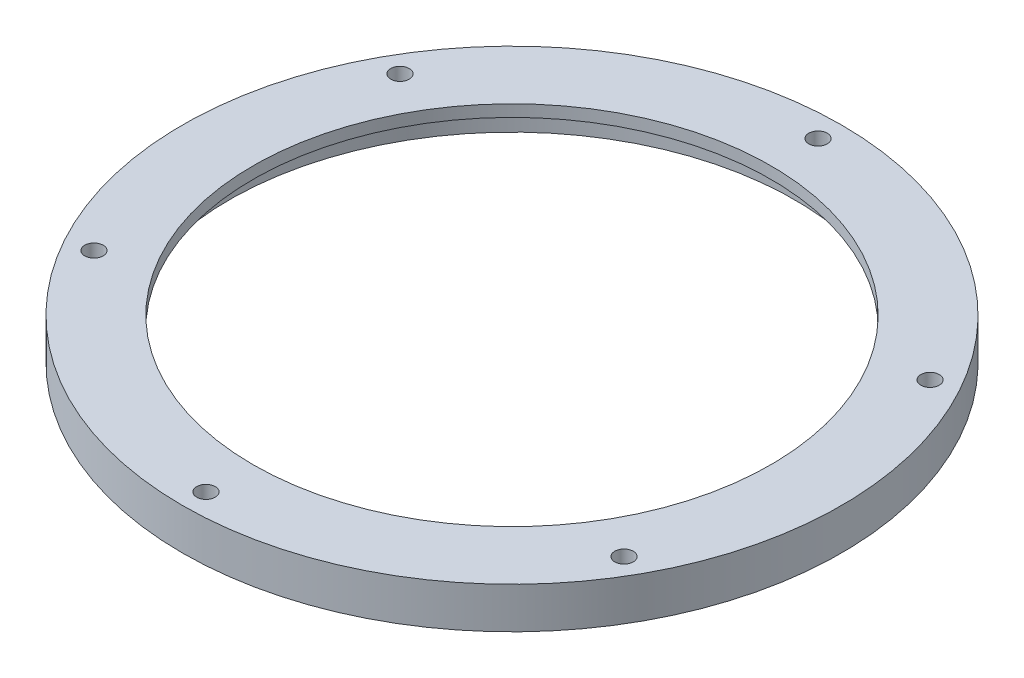
ISO-10303-21;
HEADER;
FILE_DESCRIPTION(('STEP AP214'),'2;1');
FILE_NAME('part.step','',(''),(''),'','','');
FILE_SCHEMA(('AUTOMOTIVE_DESIGN { 1 0 10303 214 1 1 1 1 }'));
ENDSEC;
DATA;
#1=APPLICATION_CONTEXT('core data for automotive mechanical design processes');
#2=APPLICATION_PROTOCOL_DEFINITION('international standard','automotive_design',2000,#1);
#3=PRODUCT_CONTEXT('',#1,'mechanical');
#4=PRODUCT('Part','Part','',(#3));
#5=PRODUCT_RELATED_PRODUCT_CATEGORY('part','',(#4));
#6=PRODUCT_DEFINITION_FORMATION('','',#4);
#7=PRODUCT_DEFINITION_CONTEXT('part definition',#1,'design');
#8=PRODUCT_DEFINITION('design','',#6,#7);
#9=PRODUCT_DEFINITION_SHAPE('','',#8);
#10=(LENGTH_UNIT() NAMED_UNIT(*) SI_UNIT(.MILLI.,.METRE.));
#11=(NAMED_UNIT(*) PLANE_ANGLE_UNIT() SI_UNIT($,.RADIAN.));
#12=(NAMED_UNIT(*) SI_UNIT($,.STERADIAN.) SOLID_ANGLE_UNIT());
#13=UNCERTAINTY_MEASURE_WITH_UNIT(LENGTH_MEASURE(1.E-05),#10,'distance_accuracy_value','');
#14=(GEOMETRIC_REPRESENTATION_CONTEXT(3) GLOBAL_UNCERTAINTY_ASSIGNED_CONTEXT((#13)) GLOBAL_UNIT_ASSIGNED_CONTEXT((#10,
#11,#12)) REPRESENTATION_CONTEXT('',''));
#15=CARTESIAN_POINT('',(0.,0.,0.));
#16=DIRECTION('',(0.,0.,1.));
#17=DIRECTION('',(1.,0.,0.));
#18=AXIS2_PLACEMENT_3D('',#15,#16,#17);
#19=CARTESIAN_POINT('',(0.,0.,0.));
#20=DIRECTION('',(0.,1.,0.));
#21=DIRECTION('',(0.,0.,1.));
#22=AXIS2_PLACEMENT_3D('',#19,#20,#21);
#23=PLANE('',#22);
#24=CARTESIAN_POINT('',(71.4903970824049,0.,-41.2750000000008));
#25=DIRECTION('',(0.,1.,0.));
#26=DIRECTION('',(-0.866025403784433,0.,0.50000000000001));
#27=AXIS2_PLACEMENT_3D('',#24,#25,#26);
#28=CIRCLE('',#27,2.5);
#29=CARTESIAN_POINT('',(69.3253335729438,0.,-40.0250000000008));
#30=VERTEX_POINT('',#29);
#31=EDGE_CURVE('E85',#30,#30,#28,.T.);
#32=ORIENTED_EDGE('',*,*,#31,.T.);
#33=EDGE_LOOP('',(#32));
#34=FACE_BOUND('',#33,.T.);
#35=CARTESIAN_POINT('',(71.4903970824058,0.,41.2749999999993));
#36=DIRECTION('',(0.,1.,0.));
#37=DIRECTION('',(-0.866025403784443,0.,-0.499999999999992));
#38=AXIS2_PLACEMENT_3D('',#35,#36,#37);
#39=CIRCLE('',#38,2.5);
#40=CARTESIAN_POINT('',(69.3253335729447,0.,40.0249999999994));
#41=VERTEX_POINT('',#40);
#42=EDGE_CURVE('E91',#41,#41,#39,.T.);
#43=ORIENTED_EDGE('',*,*,#42,.T.);
#44=EDGE_LOOP('',(#43));
#45=FACE_BOUND('',#44,.T.);
#46=CARTESIAN_POINT('',(0.,0.,82.55));
#47=DIRECTION('',(0.,1.,0.));
#48=DIRECTION('',(0.,0.,-1.));
#49=AXIS2_PLACEMENT_3D('',#46,#47,#48);
#50=CIRCLE('',#49,2.5);
#51=CARTESIAN_POINT('',(0.,0.,80.05));
#52=VERTEX_POINT('',#51);
#53=EDGE_CURVE('E97',#52,#52,#50,.T.);
#54=ORIENTED_EDGE('',*,*,#53,.T.);
#55=EDGE_LOOP('',(#54));
#56=FACE_BOUND('',#55,.T.);
#57=CARTESIAN_POINT('',(-71.4903970824052,0.,41.2750000000003));
#58=DIRECTION('',(0.,1.,0.));
#59=DIRECTION('',(0.866025403784436,0.,-0.500000000000004));
#60=AXIS2_PLACEMENT_3D('',#57,#58,#59);
#61=CIRCLE('',#60,2.5);
#62=CARTESIAN_POINT('',(-69.3253335729441,0.,40.0250000000003));
#63=VERTEX_POINT('',#62);
#64=EDGE_CURVE('E79',#63,#63,#61,.T.);
#65=ORIENTED_EDGE('',*,*,#64,.T.);
#66=EDGE_LOOP('',(#65));
#67=FACE_BOUND('',#66,.T.);
#68=CARTESIAN_POINT('',(-71.4903970824055,0.,-41.2749999999998));
#69=DIRECTION('',(0.,1.,0.));
#70=DIRECTION('',(0.86602540378444,0.,0.499999999999998));
#71=AXIS2_PLACEMENT_3D('',#68,#69,#70);
#72=CIRCLE('',#71,2.5);
#73=CARTESIAN_POINT('',(-69.3253335729444,0.,-40.0249999999998));
#74=VERTEX_POINT('',#73);
#75=EDGE_CURVE('E73',#74,#74,#72,.T.);
#76=ORIENTED_EDGE('',*,*,#75,.T.);
#77=EDGE_LOOP('',(#76));
#78=FACE_BOUND('',#77,.T.);
#79=CARTESIAN_POINT('',(0.,0.,-82.55));
#80=DIRECTION('',(0.,1.,0.));
#81=DIRECTION('',(0.,0.,1.));
#82=AXIS2_PLACEMENT_3D('',#79,#80,#81);
#83=CIRCLE('',#82,2.5);
#84=CARTESIAN_POINT('',(0.,0.,-80.05));
#85=VERTEX_POINT('',#84);
#86=EDGE_CURVE('E67',#85,#85,#83,.T.);
#87=ORIENTED_EDGE('',*,*,#86,.T.);
#88=EDGE_LOOP('',(#87));
#89=FACE_BOUND('',#88,.T.);
#90=CARTESIAN_POINT('',(0.,0.,0.));
#91=DIRECTION('',(0.,1.,0.));
#92=DIRECTION('',(0.,0.,1.));
#93=AXIS2_PLACEMENT_3D('',#90,#91,#92);
#94=CIRCLE('',#93,88.9);
#95=CARTESIAN_POINT('',(0.,0.,88.9));
#96=VERTEX_POINT('',#95);
#97=EDGE_CURVE('E10',#96,#96,#94,.T.);
#98=ORIENTED_EDGE('',*,*,#97,.F.);
#99=EDGE_LOOP('',(#98));
#100=FACE_BOUND('',#99,.T.);
#101=CARTESIAN_POINT('',(0.,0.,0.));
#102=DIRECTION('',(0.,1.,0.));
#103=DIRECTION('',(0.,0.,1.));
#104=AXIS2_PLACEMENT_3D('',#101,#102,#103);
#105=CIRCLE('',#104,76.2);
#106=CARTESIAN_POINT('',(0.,0.,76.2));
#107=VERTEX_POINT('',#106);
#108=EDGE_CURVE('E50',#107,#107,#105,.T.);
#109=ORIENTED_EDGE('',*,*,#108,.T.);
#110=EDGE_LOOP('',(#109));
#111=FACE_BOUND('',#110,.T.);
#112=ADVANCED_FACE('F43',(#34,#45,#56,#67,#78,#89,#100,#111),#23,.F.);
#113=CARTESIAN_POINT('',(0.,7.9375,0.));
#114=DIRECTION('',(0.,-1.,0.));
#115=DIRECTION('',(0.,0.,-1.));
#116=AXIS2_PLACEMENT_3D('',#113,#114,#115);
#117=CYLINDRICAL_SURFACE('',#116,88.9);
#118=ORIENTED_EDGE('',*,*,#97,.T.);
#119=EDGE_LOOP('',(#118));
#120=FACE_BOUND('',#119,.T.);
#121=CARTESIAN_POINT('',(0.,11.1125,0.));
#122=DIRECTION('',(0.,1.,0.));
#123=DIRECTION('',(0.,0.,1.));
#124=AXIS2_PLACEMENT_3D('',#121,#122,#123);
#125=CIRCLE('',#124,88.9);
#126=CARTESIAN_POINT('',(0.,11.1125,88.9));
#127=VERTEX_POINT('',#126);
#128=EDGE_CURVE('E58',#127,#127,#125,.T.);
#129=ORIENTED_EDGE('',*,*,#128,.F.);
#130=EDGE_LOOP('',(#129));
#131=FACE_BOUND('',#130,.T.);
#132=ADVANCED_FACE('F45',(#120,#131),#117,.T.);
#133=CARTESIAN_POINT('',(0.,7.9375,0.));
#134=DIRECTION('',(0.,-1.,0.));
#135=DIRECTION('',(0.,0.,-1.));
#136=AXIS2_PLACEMENT_3D('',#133,#134,#135);
#137=CYLINDRICAL_SURFACE('',#136,76.2);
#138=CARTESIAN_POINT('',(0.,7.9375,0.));
#139=DIRECTION('',(0.,1.,0.));
#140=DIRECTION('',(0.,0.,1.));
#141=AXIS2_PLACEMENT_3D('',#138,#139,#140);
#142=CIRCLE('',#141,76.2);
#143=CARTESIAN_POINT('',(0.,7.9375,76.2));
#144=VERTEX_POINT('',#143);
#145=EDGE_CURVE('E54',#144,#144,#142,.T.);
#146=ORIENTED_EDGE('',*,*,#145,.T.);
#147=EDGE_LOOP('',(#146));
#148=FACE_BOUND('',#147,.T.);
#149=ORIENTED_EDGE('',*,*,#108,.F.);
#150=EDGE_LOOP('',(#149));
#151=FACE_BOUND('',#150,.T.);
#152=ADVANCED_FACE('F139',(#148,#151),#137,.F.);
#153=CARTESIAN_POINT('',(0.,7.9375,0.));
#154=DIRECTION('',(0.,1.,0.));
#155=DIRECTION('',(0.,0.,1.));
#156=AXIS2_PLACEMENT_3D('',#153,#154,#155);
#157=PLANE('',#156);
#158=CARTESIAN_POINT('',(0.,7.9375,0.));
#159=DIRECTION('',(0.,1.,0.));
#160=DIRECTION('',(0.,0.,1.));
#161=AXIS2_PLACEMENT_3D('',#158,#159,#160);
#162=CIRCLE('',#161,69.85);
#163=CARTESIAN_POINT('',(0.,7.9375,69.85));
#164=VERTEX_POINT('',#163);
#165=EDGE_CURVE('E64',#164,#164,#162,.T.);
#166=ORIENTED_EDGE('',*,*,#165,.T.);
#167=EDGE_LOOP('',(#166));
#168=FACE_BOUND('',#167,.T.);
#169=ORIENTED_EDGE('',*,*,#145,.F.);
#170=EDGE_LOOP('',(#169));
#171=FACE_BOUND('',#170,.T.);
#172=ADVANCED_FACE('F120',(#168,#171),#157,.F.);
#173=CARTESIAN_POINT('',(0.,11.1125,0.));
#174=DIRECTION('',(0.,1.,0.));
#175=DIRECTION('',(0.,0.,1.));
#176=AXIS2_PLACEMENT_3D('',#173,#174,#175);
#177=PLANE('',#176);
#178=CARTESIAN_POINT('',(71.4903970824049,11.1125,-41.2750000000008));
#179=DIRECTION('',(0.,1.,0.));
#180=DIRECTION('',(-0.866025403784433,0.,0.50000000000001));
#181=AXIS2_PLACEMENT_3D('',#178,#179,#180);
#182=CIRCLE('',#181,2.5);
#183=CARTESIAN_POINT('',(69.3253335729438,11.1125,-40.0250000000008));
#184=VERTEX_POINT('',#183);
#185=EDGE_CURVE('E82',#184,#184,#182,.T.);
#186=ORIENTED_EDGE('',*,*,#185,.F.);
#187=EDGE_LOOP('',(#186));
#188=FACE_BOUND('',#187,.T.);
#189=CARTESIAN_POINT('',(71.4903970824058,11.1125,41.2749999999993));
#190=DIRECTION('',(0.,1.,0.));
#191=DIRECTION('',(-0.866025403784443,0.,-0.499999999999992));
#192=AXIS2_PLACEMENT_3D('',#189,#190,#191);
#193=CIRCLE('',#192,2.5);
#194=CARTESIAN_POINT('',(69.3253335729447,11.1125,40.0249999999994));
#195=VERTEX_POINT('',#194);
#196=EDGE_CURVE('E88',#195,#195,#193,.T.);
#197=ORIENTED_EDGE('',*,*,#196,.F.);
#198=EDGE_LOOP('',(#197));
#199=FACE_BOUND('',#198,.T.);
#200=CARTESIAN_POINT('',(0.,11.1125,82.55));
#201=DIRECTION('',(0.,1.,0.));
#202=DIRECTION('',(0.,0.,-1.));
#203=AXIS2_PLACEMENT_3D('',#200,#201,#202);
#204=CIRCLE('',#203,2.5);
#205=CARTESIAN_POINT('',(0.,11.1125,80.05));
#206=VERTEX_POINT('',#205);
#207=EDGE_CURVE('E94',#206,#206,#204,.T.);
#208=ORIENTED_EDGE('',*,*,#207,.F.);
#209=EDGE_LOOP('',(#208));
#210=FACE_BOUND('',#209,.T.);
#211=CARTESIAN_POINT('',(-71.4903970824052,11.1125,41.2750000000003));
#212=DIRECTION('',(0.,1.,0.));
#213=DIRECTION('',(0.866025403784436,0.,-0.500000000000004));
#214=AXIS2_PLACEMENT_3D('',#211,#212,#213);
#215=CIRCLE('',#214,2.5);
#216=CARTESIAN_POINT('',(-69.3253335729441,11.1125,40.0250000000003));
#217=VERTEX_POINT('',#216);
#218=EDGE_CURVE('E100',#217,#217,#215,.T.);
#219=ORIENTED_EDGE('',*,*,#218,.F.);
#220=EDGE_LOOP('',(#219));
#221=FACE_BOUND('',#220,.T.);
#222=CARTESIAN_POINT('',(-71.4903970824055,11.1125,-41.2749999999998));
#223=DIRECTION('',(0.,1.,0.));
#224=DIRECTION('',(0.86602540378444,0.,0.499999999999998));
#225=AXIS2_PLACEMENT_3D('',#222,#223,#224);
#226=CIRCLE('',#225,2.5);
#227=CARTESIAN_POINT('',(-69.3253335729444,11.1125,-40.0249999999998));
#228=VERTEX_POINT('',#227);
#229=EDGE_CURVE('E76',#228,#228,#226,.T.);
#230=ORIENTED_EDGE('',*,*,#229,.F.);
#231=EDGE_LOOP('',(#230));
#232=FACE_BOUND('',#231,.T.);
#233=CARTESIAN_POINT('',(0.,11.1125,-82.55));
#234=DIRECTION('',(0.,1.,0.));
#235=DIRECTION('',(0.,0.,1.));
#236=AXIS2_PLACEMENT_3D('',#233,#234,#235);
#237=CIRCLE('',#236,2.5);
#238=CARTESIAN_POINT('',(0.,11.1125,-80.05));
#239=VERTEX_POINT('',#238);
#240=EDGE_CURVE('E70',#239,#239,#237,.T.);
#241=ORIENTED_EDGE('',*,*,#240,.F.);
#242=EDGE_LOOP('',(#241));
#243=FACE_BOUND('',#242,.T.);
#244=ORIENTED_EDGE('',*,*,#128,.T.);
#245=EDGE_LOOP('',(#244));
#246=FACE_BOUND('',#245,.T.);
#247=CARTESIAN_POINT('',(0.,11.1125,0.));
#248=DIRECTION('',(0.,1.,0.));
#249=DIRECTION('',(0.,0.,1.));
#250=AXIS2_PLACEMENT_3D('',#247,#248,#249);
#251=CIRCLE('',#250,69.85);
#252=CARTESIAN_POINT('',(0.,11.1125,69.85));
#253=VERTEX_POINT('',#252);
#254=EDGE_CURVE('E63',#253,#253,#251,.T.);
#255=ORIENTED_EDGE('',*,*,#254,.F.);
#256=EDGE_LOOP('',(#255));
#257=FACE_BOUND('',#256,.T.);
#258=ADVANCED_FACE('F116',(#188,#199,#210,#221,#232,#243,#246,#257),#177,.T.);
#259=CARTESIAN_POINT('',(0.,11.1125,0.));
#260=DIRECTION('',(0.,-1.,0.));
#261=DIRECTION('',(0.,0.,-1.));
#262=AXIS2_PLACEMENT_3D('',#259,#260,#261);
#263=CYLINDRICAL_SURFACE('',#262,69.85);
#264=ORIENTED_EDGE('',*,*,#254,.T.);
#265=EDGE_LOOP('',(#264));
#266=FACE_BOUND('',#265,.T.);
#267=ORIENTED_EDGE('',*,*,#165,.F.);
#268=EDGE_LOOP('',(#267));
#269=FACE_BOUND('',#268,.T.);
#270=ADVANCED_FACE('F119',(#266,#269),#263,.F.);
#271=CARTESIAN_POINT('',(0.,0.,-82.55));
#272=DIRECTION('',(0.,1.,0.));
#273=DIRECTION('',(0.,0.,1.));
#274=AXIS2_PLACEMENT_3D('',#271,#272,#273);
#275=CYLINDRICAL_SURFACE('',#274,2.5);
#276=ORIENTED_EDGE('',*,*,#86,.F.);
#277=EDGE_LOOP('',(#276));
#278=FACE_BOUND('',#277,.T.);
#279=ORIENTED_EDGE('',*,*,#240,.T.);
#280=EDGE_LOOP('',(#279));
#281=FACE_BOUND('',#280,.T.);
#282=ADVANCED_FACE('F133',(#278,#281),#275,.F.);
#283=CARTESIAN_POINT('',(-71.4903970824055,0.,-41.2749999999998));
#284=DIRECTION('',(0.,1.,0.));
#285=DIRECTION('',(0.,0.,1.));
#286=AXIS2_PLACEMENT_3D('',#283,#284,#285);
#287=CYLINDRICAL_SURFACE('',#286,2.5);
#288=ORIENTED_EDGE('',*,*,#75,.F.);
#289=EDGE_LOOP('',(#288));
#290=FACE_BOUND('',#289,.T.);
#291=ORIENTED_EDGE('',*,*,#229,.T.);
#292=EDGE_LOOP('',(#291));
#293=FACE_BOUND('',#292,.T.);
#294=ADVANCED_FACE('F112',(#290,#293),#287,.F.);
#295=CARTESIAN_POINT('',(-71.4903970824052,0.,41.2750000000003));
#296=DIRECTION('',(0.,1.,0.));
#297=DIRECTION('',(0.,0.,1.));
#298=AXIS2_PLACEMENT_3D('',#295,#296,#297);
#299=CYLINDRICAL_SURFACE('',#298,2.5);
#300=ORIENTED_EDGE('',*,*,#64,.F.);
#301=EDGE_LOOP('',(#300));
#302=FACE_BOUND('',#301,.T.);
#303=ORIENTED_EDGE('',*,*,#218,.T.);
#304=EDGE_LOOP('',(#303));
#305=FACE_BOUND('',#304,.T.);
#306=ADVANCED_FACE('F108',(#302,#305),#299,.F.);
#307=CARTESIAN_POINT('',(0.,0.,82.55));
#308=DIRECTION('',(0.,1.,0.));
#309=DIRECTION('',(0.,0.,1.));
#310=AXIS2_PLACEMENT_3D('',#307,#308,#309);
#311=CYLINDRICAL_SURFACE('',#310,2.5);
#312=ORIENTED_EDGE('',*,*,#53,.F.);
#313=EDGE_LOOP('',(#312));
#314=FACE_BOUND('',#313,.T.);
#315=ORIENTED_EDGE('',*,*,#207,.T.);
#316=EDGE_LOOP('',(#315));
#317=FACE_BOUND('',#316,.T.);
#318=ADVANCED_FACE('F111',(#314,#317),#311,.F.);
#319=CARTESIAN_POINT('',(71.4903970824058,0.,41.2749999999993));
#320=DIRECTION('',(0.,1.,0.));
#321=DIRECTION('',(0.,0.,1.));
#322=AXIS2_PLACEMENT_3D('',#319,#320,#321);
#323=CYLINDRICAL_SURFACE('',#322,2.5);
#324=ORIENTED_EDGE('',*,*,#42,.F.);
#325=EDGE_LOOP('',(#324));
#326=FACE_BOUND('',#325,.T.);
#327=ORIENTED_EDGE('',*,*,#196,.T.);
#328=EDGE_LOOP('',(#327));
#329=FACE_BOUND('',#328,.T.);
#330=ADVANCED_FACE('F162',(#326,#329),#323,.F.);
#331=CARTESIAN_POINT('',(71.4903970824049,0.,-41.2750000000008));
#332=DIRECTION('',(0.,1.,0.));
#333=DIRECTION('',(0.,0.,1.));
#334=AXIS2_PLACEMENT_3D('',#331,#332,#333);
#335=CYLINDRICAL_SURFACE('',#334,2.5);
#336=ORIENTED_EDGE('',*,*,#31,.F.);
#337=EDGE_LOOP('',(#336));
#338=FACE_BOUND('',#337,.T.);
#339=ORIENTED_EDGE('',*,*,#185,.T.);
#340=EDGE_LOOP('',(#339));
#341=FACE_BOUND('',#340,.T.);
#342=ADVANCED_FACE('F169',(#338,#341),#335,.F.);
#343=CLOSED_SHELL('',(#112,#132,#152,#172,#258,#270,#282,#294,#306,#318,#330,#342));
#344=MANIFOLD_SOLID_BREP('B2',#343);
#345=ADVANCED_BREP_SHAPE_REPRESENTATION('',(#18,#344),#14);
#346=SHAPE_DEFINITION_REPRESENTATION(#9,#345);
ENDSEC;
END-ISO-10303-21;
